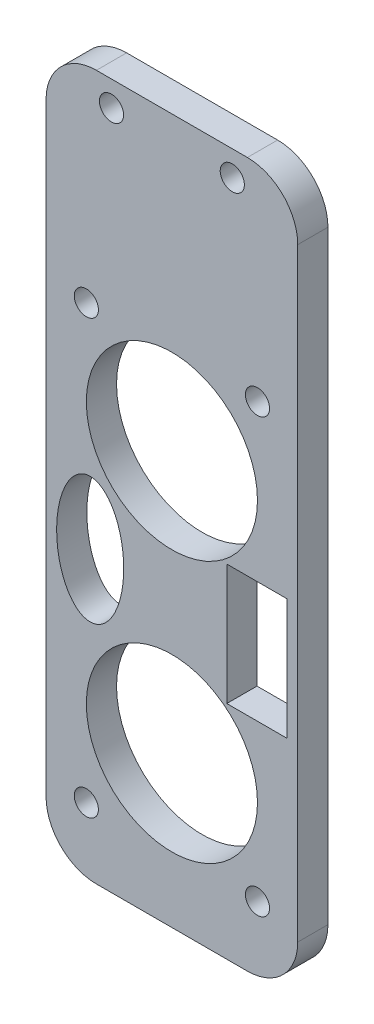
ISO-10303-21;
HEADER;
FILE_DESCRIPTION(('STEP AP214'),'2;1');
FILE_NAME('part.step','',(''),(''),'','','');
FILE_SCHEMA(('AUTOMOTIVE_DESIGN { 1 0 10303 214 1 1 1 1 }'));
ENDSEC;
DATA;
#1=APPLICATION_CONTEXT('core data for automotive mechanical design processes');
#2=APPLICATION_PROTOCOL_DEFINITION('international standard','automotive_design',2000,#1);
#3=PRODUCT_CONTEXT('',#1,'mechanical');
#4=PRODUCT('Part','Part','',(#3));
#5=PRODUCT_RELATED_PRODUCT_CATEGORY('part','',(#4));
#6=PRODUCT_DEFINITION_FORMATION('','',#4);
#7=PRODUCT_DEFINITION_CONTEXT('part definition',#1,'design');
#8=PRODUCT_DEFINITION('design','',#6,#7);
#9=PRODUCT_DEFINITION_SHAPE('','',#8);
#10=(LENGTH_UNIT() NAMED_UNIT(*) SI_UNIT(.MILLI.,.METRE.));
#11=(NAMED_UNIT(*) PLANE_ANGLE_UNIT() SI_UNIT($,.RADIAN.));
#12=(NAMED_UNIT(*) SI_UNIT($,.STERADIAN.) SOLID_ANGLE_UNIT());
#13=UNCERTAINTY_MEASURE_WITH_UNIT(LENGTH_MEASURE(1.E-05),#10,'distance_accuracy_value','');
#14=(GEOMETRIC_REPRESENTATION_CONTEXT(3) GLOBAL_UNCERTAINTY_ASSIGNED_CONTEXT((#13)) GLOBAL_UNIT_ASSIGNED_CONTEXT((#10,
#11,#12)) REPRESENTATION_CONTEXT('',''));
#15=CARTESIAN_POINT('',(0.,0.,0.));
#16=DIRECTION('',(0.,0.,1.));
#17=DIRECTION('',(1.,0.,0.));
#18=AXIS2_PLACEMENT_3D('',#15,#16,#17);
#19=CARTESIAN_POINT('',(0.,0.,3.));
#20=DIRECTION('',(0.,0.,1.));
#21=DIRECTION('',(1.,0.,0.));
#22=AXIS2_PLACEMENT_3D('',#19,#20,#21);
#23=PLANE('',#22);
#24=CARTESIAN_POINT('',(4.38203658149888,-41.5,3.));
#25=DIRECTION('',(0.,0.,-1.));
#26=DIRECTION('',(0.,-1.,0.));
#27=AXIS2_PLACEMENT_3D('',#24,#25,#26);
#28=ELLIPSE('',#27,6.26487533631212,3.33161000543766);
#29=CARTESIAN_POINT('',(4.38203658149888,-47.7648753363121,3.));
#30=VERTEX_POINT('',#29);
#31=EDGE_CURVE('E152',#30,#30,#28,.T.);
#32=ORIENTED_EDGE('',*,*,#31,.T.);
#33=EDGE_LOOP('',(#32));
#34=FACE_BOUND('',#33,.T.);
#35=DIRECTION('',(0.,-1.,0.));
#36=VECTOR('',#35,1.);
#37=CARTESIAN_POINT('',(17.9537879869003,-36.,3.));
#38=LINE('',#37,#36);
#39=CARTESIAN_POINT('',(17.9537879869003,-36.,3.));
#40=VERTEX_POINT('',#39);
#41=CARTESIAN_POINT('',(17.9537879869003,-48.,3.));
#42=VERTEX_POINT('',#41);
#43=EDGE_CURVE('E48',#40,#42,#38,.T.);
#44=ORIENTED_EDGE('',*,*,#43,.F.);
#45=DIRECTION('',(-1.,0.,0.));
#46=VECTOR('',#45,1.);
#47=CARTESIAN_POINT('',(17.9537879869003,-36.,3.));
#48=LINE('',#47,#46);
#49=CARTESIAN_POINT('',(23.9537879869003,-36.,3.));
#50=VERTEX_POINT('',#49);
#51=EDGE_CURVE('E139',#50,#40,#48,.T.);
#52=ORIENTED_EDGE('',*,*,#51,.F.);
#53=DIRECTION('',(0.,1.,0.));
#54=VECTOR('',#53,1.);
#55=CARTESIAN_POINT('',(23.9537879869003,-36.,3.));
#56=LINE('',#55,#54);
#57=CARTESIAN_POINT('',(23.9537879869003,-48.,3.));
#58=VERTEX_POINT('',#57);
#59=EDGE_CURVE('E142',#58,#50,#56,.T.);
#60=ORIENTED_EDGE('',*,*,#59,.F.);
#61=DIRECTION('',(1.,0.,0.));
#62=VECTOR('',#61,1.);
#63=CARTESIAN_POINT('',(17.9537879869003,-48.,3.));
#64=LINE('',#63,#62);
#65=EDGE_CURVE('E151',#42,#58,#64,.T.);
#66=ORIENTED_EDGE('',*,*,#65,.F.);
#67=EDGE_LOOP('',(#44,#52,#60,#66));
#68=FACE_BOUND('',#67,.T.);
#69=CARTESIAN_POINT('',(6.5,-2.5,3.));
#70=DIRECTION('',(0.,0.,1.));
#71=DIRECTION('',(1.,0.,0.));
#72=AXIS2_PLACEMENT_3D('',#69,#70,#71);
#73=CIRCLE('',#72,1.2);
#74=CARTESIAN_POINT('',(7.7,-2.5,3.));
#75=VERTEX_POINT('',#74);
#76=EDGE_CURVE('E158',#75,#75,#73,.T.);
#77=ORIENTED_EDGE('',*,*,#76,.F.);
#78=EDGE_LOOP('',(#77));
#79=FACE_BOUND('',#78,.T.);
#80=CARTESIAN_POINT('',(18.5,-2.5,3.));
#81=DIRECTION('',(0.,0.,1.));
#82=DIRECTION('',(1.,0.,0.));
#83=AXIS2_PLACEMENT_3D('',#80,#81,#82);
#84=CIRCLE('',#83,1.2);
#85=CARTESIAN_POINT('',(19.7,-2.5,3.));
#86=VERTEX_POINT('',#85);
#87=EDGE_CURVE('E165',#86,#86,#84,.T.);
#88=ORIENTED_EDGE('',*,*,#87,.F.);
#89=EDGE_LOOP('',(#88));
#90=FACE_BOUND('',#89,.T.);
#91=CARTESIAN_POINT('',(3.99999999999985,-20.5000000000001,3.));
#92=DIRECTION('',(0.,0.,1.));
#93=DIRECTION('',(1.,0.,0.));
#94=AXIS2_PLACEMENT_3D('',#91,#92,#93);
#95=CIRCLE('',#94,1.2);
#96=CARTESIAN_POINT('',(5.19999999999985,-20.5000000000001,3.));
#97=VERTEX_POINT('',#96);
#98=EDGE_CURVE('E180',#97,#97,#95,.T.);
#99=ORIENTED_EDGE('',*,*,#98,.F.);
#100=EDGE_LOOP('',(#99));
#101=FACE_BOUND('',#100,.T.);
#102=CARTESIAN_POINT('',(21.,-63.4999999999999,3.));
#103=DIRECTION('',(0.,0.,1.));
#104=DIRECTION('',(1.,0.,0.));
#105=AXIS2_PLACEMENT_3D('',#102,#103,#104);
#106=CIRCLE('',#105,1.2);
#107=CARTESIAN_POINT('',(22.2,-63.4999999999999,3.));
#108=VERTEX_POINT('',#107);
#109=EDGE_CURVE('E192',#108,#108,#106,.T.);
#110=ORIENTED_EDGE('',*,*,#109,.F.);
#111=EDGE_LOOP('',(#110));
#112=FACE_BOUND('',#111,.T.);
#113=CARTESIAN_POINT('',(12.5,-29.,3.));
#114=DIRECTION('',(0.,0.,1.));
#115=DIRECTION('',(1.,0.,0.));
#116=AXIS2_PLACEMENT_3D('',#113,#114,#115);
#117=CIRCLE('',#116,8.50000000000017);
#118=CARTESIAN_POINT('',(21.0000000000002,-29.,3.));
#119=VERTEX_POINT('',#118);
#120=EDGE_CURVE('E204',#119,#119,#117,.T.);
#121=ORIENTED_EDGE('',*,*,#120,.F.);
#122=EDGE_LOOP('',(#121));
#123=FACE_BOUND('',#122,.T.);
#124=DIRECTION('',(1.,0.,0.));
#125=VECTOR('',#124,1.);
#126=CARTESIAN_POINT('',(0.,-70.,3.));
#127=LINE('',#126,#125);
#128=CARTESIAN_POINT('',(5.00000000000001,-70.,3.));
#129=VERTEX_POINT('',#128);
#130=CARTESIAN_POINT('',(20.,-70.,3.));
#131=VERTEX_POINT('',#130);
#132=EDGE_CURVE('E213',#129,#131,#127,.T.);
#133=ORIENTED_EDGE('',*,*,#132,.T.);
#134=CARTESIAN_POINT('',(20.,-65.,3.));
#135=DIRECTION('',(0.,0.,1.));
#136=DIRECTION('',(1.,0.,0.));
#137=AXIS2_PLACEMENT_3D('',#134,#135,#136);
#138=CIRCLE('',#137,5.);
#139=CARTESIAN_POINT('',(25.,-65.,3.));
#140=VERTEX_POINT('',#139);
#141=EDGE_CURVE('E257',#131,#140,#138,.T.);
#142=ORIENTED_EDGE('',*,*,#141,.T.);
#143=DIRECTION('',(0.,1.,0.));
#144=VECTOR('',#143,1.);
#145=CARTESIAN_POINT('',(25.,0.,3.));
#146=LINE('',#145,#144);
#147=CARTESIAN_POINT('',(25.,-5.,3.));
#148=VERTEX_POINT('',#147);
#149=EDGE_CURVE('E217',#140,#148,#146,.T.);
#150=ORIENTED_EDGE('',*,*,#149,.T.);
#151=CARTESIAN_POINT('',(20.,-5.,3.));
#152=DIRECTION('',(0.,0.,1.));
#153=DIRECTION('',(1.,0.,0.));
#154=AXIS2_PLACEMENT_3D('',#151,#152,#153);
#155=CIRCLE('',#154,5.);
#156=CARTESIAN_POINT('',(20.,0.,3.));
#157=VERTEX_POINT('',#156);
#158=EDGE_CURVE('E251',#148,#157,#155,.T.);
#159=ORIENTED_EDGE('',*,*,#158,.T.);
#160=DIRECTION('',(-1.,0.,0.));
#161=VECTOR('',#160,1.);
#162=CARTESIAN_POINT('',(0.,0.,3.));
#163=LINE('',#162,#161);
#164=CARTESIAN_POINT('',(5.,0.,3.));
#165=VERTEX_POINT('',#164);
#166=EDGE_CURVE('E220',#157,#165,#163,.T.);
#167=ORIENTED_EDGE('',*,*,#166,.T.);
#168=CARTESIAN_POINT('',(5.,-5.,3.));
#169=DIRECTION('',(0.,0.,1.));
#170=DIRECTION('',(1.,0.,0.));
#171=AXIS2_PLACEMENT_3D('',#168,#169,#170);
#172=CIRCLE('',#171,5.);
#173=CARTESIAN_POINT('',(0.,-5.,3.));
#174=VERTEX_POINT('',#173);
#175=EDGE_CURVE('E253',#165,#174,#172,.T.);
#176=ORIENTED_EDGE('',*,*,#175,.T.);
#177=DIRECTION('',(0.,-1.,0.));
#178=VECTOR('',#177,1.);
#179=CARTESIAN_POINT('',(0.,0.,3.));
#180=LINE('',#179,#178);
#181=CARTESIAN_POINT('',(0.,-65.,3.));
#182=VERTEX_POINT('',#181);
#183=EDGE_CURVE('E210',#174,#182,#180,.T.);
#184=ORIENTED_EDGE('',*,*,#183,.T.);
#185=CARTESIAN_POINT('',(5.00000000000001,-65.,3.));
#186=DIRECTION('',(0.,0.,1.));
#187=DIRECTION('',(1.,0.,0.));
#188=AXIS2_PLACEMENT_3D('',#185,#186,#187);
#189=CIRCLE('',#188,5.);
#190=EDGE_CURVE('E255',#182,#129,#189,.T.);
#191=ORIENTED_EDGE('',*,*,#190,.T.);
#192=EDGE_LOOP('',(#133,#142,#150,#159,#167,#176,#184,#191));
#193=FACE_BOUND('',#192,.T.);
#194=CARTESIAN_POINT('',(12.5,-55.,3.));
#195=DIRECTION('',(0.,0.,1.));
#196=DIRECTION('',(1.,0.,0.));
#197=AXIS2_PLACEMENT_3D('',#194,#195,#196);
#198=CIRCLE('',#197,8.50000000000017);
#199=CARTESIAN_POINT('',(21.0000000000002,-55.,3.));
#200=VERTEX_POINT('',#199);
#201=EDGE_CURVE('E198',#200,#200,#198,.T.);
#202=ORIENTED_EDGE('',*,*,#201,.F.);
#203=EDGE_LOOP('',(#202));
#204=FACE_BOUND('',#203,.T.);
#205=CARTESIAN_POINT('',(4.,-63.5000000000001,3.));
#206=DIRECTION('',(0.,0.,1.));
#207=DIRECTION('',(1.,0.,0.));
#208=AXIS2_PLACEMENT_3D('',#205,#206,#207);
#209=CIRCLE('',#208,1.2);
#210=CARTESIAN_POINT('',(5.2,-63.5000000000001,3.));
#211=VERTEX_POINT('',#210);
#212=EDGE_CURVE('E186',#211,#211,#209,.T.);
#213=ORIENTED_EDGE('',*,*,#212,.F.);
#214=EDGE_LOOP('',(#213));
#215=FACE_BOUND('',#214,.T.);
#216=CARTESIAN_POINT('',(20.9999999999999,-20.5,3.));
#217=DIRECTION('',(0.,0.,1.));
#218=DIRECTION('',(1.,0.,0.));
#219=AXIS2_PLACEMENT_3D('',#216,#217,#218);
#220=CIRCLE('',#219,1.2);
#221=CARTESIAN_POINT('',(22.1999999999999,-20.5,3.));
#222=VERTEX_POINT('',#221);
#223=EDGE_CURVE('E174',#222,#222,#220,.T.);
#224=ORIENTED_EDGE('',*,*,#223,.F.);
#225=EDGE_LOOP('',(#224));
#226=FACE_BOUND('',#225,.T.);
#227=ADVANCED_FACE('F33',(#34,#68,#79,#90,#101,#112,#123,#193,#204,#215,#226),#23,.T.);
#228=CARTESIAN_POINT('',(0.,0.,0.));
#229=DIRECTION('',(0.,0.,1.));
#230=DIRECTION('',(1.,0.,0.));
#231=AXIS2_PLACEMENT_3D('',#228,#229,#230);
#232=PLANE('',#231);
#233=CARTESIAN_POINT('',(4.38203658149888,-41.5,0.));
#234=DIRECTION('',(0.,0.,-1.));
#235=DIRECTION('',(0.,-1.,0.));
#236=AXIS2_PLACEMENT_3D('',#233,#234,#235);
#237=ELLIPSE('',#236,6.26487533631212,3.33161000543766);
#238=CARTESIAN_POINT('',(4.38203658149888,-47.7648753363121,0.));
#239=VERTEX_POINT('',#238);
#240=EDGE_CURVE('E145',#239,#239,#237,.T.);
#241=ORIENTED_EDGE('',*,*,#240,.F.);
#242=EDGE_LOOP('',(#241));
#243=FACE_BOUND('',#242,.T.);
#244=DIRECTION('',(-1.,0.,0.));
#245=VECTOR('',#244,1.);
#246=CARTESIAN_POINT('',(17.9537879869003,-36.,0.));
#247=LINE('',#246,#245);
#248=CARTESIAN_POINT('',(23.9537879869003,-36.,0.));
#249=VERTEX_POINT('',#248);
#250=CARTESIAN_POINT('',(17.9537879869003,-36.,0.));
#251=VERTEX_POINT('',#250);
#252=EDGE_CURVE('E129',#249,#251,#247,.T.);
#253=ORIENTED_EDGE('',*,*,#252,.T.);
#254=DIRECTION('',(0.,-1.,0.));
#255=VECTOR('',#254,1.);
#256=CARTESIAN_POINT('',(17.9537879869003,-36.,0.));
#257=LINE('',#256,#255);
#258=CARTESIAN_POINT('',(17.9537879869003,-48.,0.));
#259=VERTEX_POINT('',#258);
#260=EDGE_CURVE('E123',#251,#259,#257,.T.);
#261=ORIENTED_EDGE('',*,*,#260,.T.);
#262=DIRECTION('',(1.,0.,0.));
#263=VECTOR('',#262,1.);
#264=CARTESIAN_POINT('',(17.9537879869003,-48.,0.));
#265=LINE('',#264,#263);
#266=CARTESIAN_POINT('',(23.9537879869003,-48.,0.));
#267=VERTEX_POINT('',#266);
#268=EDGE_CURVE('E132',#259,#267,#265,.T.);
#269=ORIENTED_EDGE('',*,*,#268,.T.);
#270=DIRECTION('',(0.,1.,0.));
#271=VECTOR('',#270,1.);
#272=CARTESIAN_POINT('',(23.9537879869003,-36.,0.));
#273=LINE('',#272,#271);
#274=EDGE_CURVE('E56',#267,#249,#273,.T.);
#275=ORIENTED_EDGE('',*,*,#274,.T.);
#276=EDGE_LOOP('',(#253,#261,#269,#275));
#277=FACE_BOUND('',#276,.T.);
#278=CARTESIAN_POINT('',(6.5,-2.5,0.));
#279=DIRECTION('',(0.,0.,1.));
#280=DIRECTION('',(1.,0.,0.));
#281=AXIS2_PLACEMENT_3D('',#278,#279,#280);
#282=CIRCLE('',#281,1.2);
#283=CARTESIAN_POINT('',(7.7,-2.5,0.));
#284=VERTEX_POINT('',#283);
#285=EDGE_CURVE('E162',#284,#284,#282,.F.);
#286=ORIENTED_EDGE('',*,*,#285,.F.);
#287=EDGE_LOOP('',(#286));
#288=FACE_BOUND('',#287,.T.);
#289=CARTESIAN_POINT('',(18.5,-2.5,0.));
#290=DIRECTION('',(0.,0.,1.));
#291=DIRECTION('',(1.,0.,0.));
#292=AXIS2_PLACEMENT_3D('',#289,#290,#291);
#293=CIRCLE('',#292,1.2);
#294=CARTESIAN_POINT('',(19.7,-2.5,0.));
#295=VERTEX_POINT('',#294);
#296=EDGE_CURVE('E168',#295,#295,#293,.F.);
#297=ORIENTED_EDGE('',*,*,#296,.F.);
#298=EDGE_LOOP('',(#297));
#299=FACE_BOUND('',#298,.T.);
#300=DIRECTION('',(0.,1.,0.));
#301=VECTOR('',#300,1.);
#302=CARTESIAN_POINT('',(25.,0.,0.));
#303=LINE('',#302,#301);
#304=CARTESIAN_POINT('',(25.,-65.,0.));
#305=VERTEX_POINT('',#304);
#306=CARTESIAN_POINT('',(25.,-5.,0.));
#307=VERTEX_POINT('',#306);
#308=EDGE_CURVE('E229',#305,#307,#303,.T.);
#309=ORIENTED_EDGE('',*,*,#308,.F.);
#310=CARTESIAN_POINT('',(20.,-65.,0.));
#311=DIRECTION('',(0.,0.,1.));
#312=DIRECTION('',(1.,0.,0.));
#313=AXIS2_PLACEMENT_3D('',#310,#311,#312);
#314=CIRCLE('',#313,5.);
#315=CARTESIAN_POINT('',(20.,-70.,0.));
#316=VERTEX_POINT('',#315);
#317=EDGE_CURVE('E244',#305,#316,#314,.F.);
#318=ORIENTED_EDGE('',*,*,#317,.T.);
#319=DIRECTION('',(1.,0.,0.));
#320=VECTOR('',#319,1.);
#321=CARTESIAN_POINT('',(0.,-70.,0.));
#322=LINE('',#321,#320);
#323=CARTESIAN_POINT('',(5.00000000000001,-70.,0.));
#324=VERTEX_POINT('',#323);
#325=EDGE_CURVE('E226',#324,#316,#322,.T.);
#326=ORIENTED_EDGE('',*,*,#325,.F.);
#327=CARTESIAN_POINT('',(5.00000000000001,-65.,0.));
#328=DIRECTION('',(0.,0.,1.));
#329=DIRECTION('',(1.,0.,0.));
#330=AXIS2_PLACEMENT_3D('',#327,#328,#329);
#331=CIRCLE('',#330,5.);
#332=CARTESIAN_POINT('',(0.,-65.,0.));
#333=VERTEX_POINT('',#332);
#334=EDGE_CURVE('E242',#324,#333,#331,.F.);
#335=ORIENTED_EDGE('',*,*,#334,.T.);
#336=DIRECTION('',(0.,-1.,0.));
#337=VECTOR('',#336,1.);
#338=CARTESIAN_POINT('',(0.,0.,0.));
#339=LINE('',#338,#337);
#340=CARTESIAN_POINT('',(0.,-5.,0.));
#341=VERTEX_POINT('',#340);
#342=EDGE_CURVE('E207',#341,#333,#339,.T.);
#343=ORIENTED_EDGE('',*,*,#342,.F.);
#344=CARTESIAN_POINT('',(5.,-5.,0.));
#345=DIRECTION('',(0.,0.,1.));
#346=DIRECTION('',(1.,0.,0.));
#347=AXIS2_PLACEMENT_3D('',#344,#345,#346);
#348=CIRCLE('',#347,5.);
#349=CARTESIAN_POINT('',(5.,0.,0.));
#350=VERTEX_POINT('',#349);
#351=EDGE_CURVE('E240',#341,#350,#348,.F.);
#352=ORIENTED_EDGE('',*,*,#351,.T.);
#353=DIRECTION('',(-1.,0.,0.));
#354=VECTOR('',#353,1.);
#355=CARTESIAN_POINT('',(0.,0.,0.));
#356=LINE('',#355,#354);
#357=CARTESIAN_POINT('',(20.,0.,0.));
#358=VERTEX_POINT('',#357);
#359=EDGE_CURVE('E214',#358,#350,#356,.T.);
#360=ORIENTED_EDGE('',*,*,#359,.F.);
#361=CARTESIAN_POINT('',(20.,-5.,0.));
#362=DIRECTION('',(0.,0.,1.));
#363=DIRECTION('',(1.,0.,0.));
#364=AXIS2_PLACEMENT_3D('',#361,#362,#363);
#365=CIRCLE('',#364,5.);
#366=EDGE_CURVE('E238',#358,#307,#365,.F.);
#367=ORIENTED_EDGE('',*,*,#366,.T.);
#368=EDGE_LOOP('',(#309,#318,#326,#335,#343,#352,#360,#367));
#369=FACE_BOUND('',#368,.T.);
#370=CARTESIAN_POINT('',(12.5,-29.,0.));
#371=DIRECTION('',(0.,0.,1.));
#372=DIRECTION('',(1.,0.,0.));
#373=AXIS2_PLACEMENT_3D('',#370,#371,#372);
#374=CIRCLE('',#373,8.50000000000017);
#375=CARTESIAN_POINT('',(21.0000000000002,-29.,0.));
#376=VERTEX_POINT('',#375);
#377=EDGE_CURVE('E201',#376,#376,#374,.T.);
#378=ORIENTED_EDGE('',*,*,#377,.T.);
#379=EDGE_LOOP('',(#378));
#380=FACE_BOUND('',#379,.T.);
#381=CARTESIAN_POINT('',(12.5,-55.,0.));
#382=DIRECTION('',(0.,0.,1.));
#383=DIRECTION('',(1.,0.,0.));
#384=AXIS2_PLACEMENT_3D('',#381,#382,#383);
#385=CIRCLE('',#384,8.50000000000017);
#386=CARTESIAN_POINT('',(21.0000000000002,-55.,0.));
#387=VERTEX_POINT('',#386);
#388=EDGE_CURVE('E195',#387,#387,#385,.T.);
#389=ORIENTED_EDGE('',*,*,#388,.T.);
#390=EDGE_LOOP('',(#389));
#391=FACE_BOUND('',#390,.T.);
#392=CARTESIAN_POINT('',(21.,-63.4999999999999,0.));
#393=DIRECTION('',(0.,0.,1.));
#394=DIRECTION('',(1.,0.,0.));
#395=AXIS2_PLACEMENT_3D('',#392,#393,#394);
#396=CIRCLE('',#395,1.2);
#397=CARTESIAN_POINT('',(22.2,-63.4999999999999,0.));
#398=VERTEX_POINT('',#397);
#399=EDGE_CURVE('E189',#398,#398,#396,.T.);
#400=ORIENTED_EDGE('',*,*,#399,.T.);
#401=EDGE_LOOP('',(#400));
#402=FACE_BOUND('',#401,.T.);
#403=CARTESIAN_POINT('',(4.,-63.5000000000001,0.));
#404=DIRECTION('',(0.,0.,1.));
#405=DIRECTION('',(1.,0.,0.));
#406=AXIS2_PLACEMENT_3D('',#403,#404,#405);
#407=CIRCLE('',#406,1.2);
#408=CARTESIAN_POINT('',(5.2,-63.5000000000001,0.));
#409=VERTEX_POINT('',#408);
#410=EDGE_CURVE('E183',#409,#409,#407,.T.);
#411=ORIENTED_EDGE('',*,*,#410,.T.);
#412=EDGE_LOOP('',(#411));
#413=FACE_BOUND('',#412,.T.);
#414=CARTESIAN_POINT('',(3.99999999999985,-20.5000000000001,0.));
#415=DIRECTION('',(0.,0.,1.));
#416=DIRECTION('',(1.,0.,0.));
#417=AXIS2_PLACEMENT_3D('',#414,#415,#416);
#418=CIRCLE('',#417,1.2);
#419=CARTESIAN_POINT('',(5.19999999999985,-20.5000000000001,0.));
#420=VERTEX_POINT('',#419);
#421=EDGE_CURVE('E177',#420,#420,#418,.T.);
#422=ORIENTED_EDGE('',*,*,#421,.T.);
#423=EDGE_LOOP('',(#422));
#424=FACE_BOUND('',#423,.T.);
#425=CARTESIAN_POINT('',(20.9999999999999,-20.5,0.));
#426=DIRECTION('',(0.,0.,1.));
#427=DIRECTION('',(1.,0.,0.));
#428=AXIS2_PLACEMENT_3D('',#425,#426,#427);
#429=CIRCLE('',#428,1.2);
#430=CARTESIAN_POINT('',(22.1999999999999,-20.5,0.));
#431=VERTEX_POINT('',#430);
#432=EDGE_CURVE('E171',#431,#431,#429,.T.);
#433=ORIENTED_EDGE('',*,*,#432,.T.);
#434=EDGE_LOOP('',(#433));
#435=FACE_BOUND('',#434,.T.);
#436=ADVANCED_FACE('F136',(#243,#277,#288,#299,#369,#380,#391,#402,#413,#424,#435),#232,.F.);
#437=CARTESIAN_POINT('',(0.,0.,3.));
#438=DIRECTION('',(1.,0.,0.));
#439=DIRECTION('',(0.,1.,0.));
#440=AXIS2_PLACEMENT_3D('',#437,#438,#439);
#441=PLANE('',#440);
#442=ORIENTED_EDGE('',*,*,#342,.T.);
#443=DIRECTION('',(0.,0.,-1.));
#444=VECTOR('',#443,1.);
#445=CARTESIAN_POINT('',(0.,-65.,3.));
#446=LINE('',#445,#444);
#447=EDGE_CURVE('E262',#333,#182,#446,.F.);
#448=ORIENTED_EDGE('',*,*,#447,.T.);
#449=ORIENTED_EDGE('',*,*,#183,.F.);
#450=DIRECTION('',(0.,0.,-1.));
#451=VECTOR('',#450,1.);
#452=CARTESIAN_POINT('',(0.,-5.,3.));
#453=LINE('',#452,#451);
#454=EDGE_CURVE('E259',#174,#341,#453,.T.);
#455=ORIENTED_EDGE('',*,*,#454,.T.);
#456=EDGE_LOOP('',(#442,#448,#449,#455));
#457=FACE_BOUND('',#456,.T.);
#458=ADVANCED_FACE('F282',(#457),#441,.F.);
#459=CARTESIAN_POINT('',(0.,-70.,3.));
#460=DIRECTION('',(0.,1.,0.));
#461=DIRECTION('',(0.,0.,1.));
#462=AXIS2_PLACEMENT_3D('',#459,#460,#461);
#463=PLANE('',#462);
#464=ORIENTED_EDGE('',*,*,#325,.T.);
#465=DIRECTION('',(0.,0.,-1.));
#466=VECTOR('',#465,1.);
#467=CARTESIAN_POINT('',(20.,-70.,3.));
#468=LINE('',#467,#466);
#469=EDGE_CURVE('E249',#316,#131,#468,.F.);
#470=ORIENTED_EDGE('',*,*,#469,.T.);
#471=ORIENTED_EDGE('',*,*,#132,.F.);
#472=DIRECTION('',(0.,0.,-1.));
#473=VECTOR('',#472,1.);
#474=CARTESIAN_POINT('',(5.00000000000001,-70.,3.));
#475=LINE('',#474,#473);
#476=EDGE_CURVE('E246',#129,#324,#475,.T.);
#477=ORIENTED_EDGE('',*,*,#476,.T.);
#478=EDGE_LOOP('',(#464,#470,#471,#477));
#479=FACE_BOUND('',#478,.T.);
#480=ADVANCED_FACE('F293',(#479),#463,.F.);
#481=CARTESIAN_POINT('',(25.,0.,3.));
#482=DIRECTION('',(-1.,0.,0.));
#483=DIRECTION('',(0.,-1.,0.));
#484=AXIS2_PLACEMENT_3D('',#481,#482,#483);
#485=PLANE('',#484);
#486=ORIENTED_EDGE('',*,*,#149,.F.);
#487=DIRECTION('',(0.,0.,-1.));
#488=VECTOR('',#487,1.);
#489=CARTESIAN_POINT('',(25.,-65.,3.));
#490=LINE('',#489,#488);
#491=EDGE_CURVE('E235',#140,#305,#490,.T.);
#492=ORIENTED_EDGE('',*,*,#491,.T.);
#493=ORIENTED_EDGE('',*,*,#308,.T.);
#494=DIRECTION('',(0.,0.,-1.));
#495=VECTOR('',#494,1.);
#496=CARTESIAN_POINT('',(25.,-5.,3.));
#497=LINE('',#496,#495);
#498=EDGE_CURVE('E223',#307,#148,#497,.F.);
#499=ORIENTED_EDGE('',*,*,#498,.T.);
#500=EDGE_LOOP('',(#486,#492,#493,#499));
#501=FACE_BOUND('',#500,.T.);
#502=ADVANCED_FACE('F301',(#501),#485,.F.);
#503=CARTESIAN_POINT('',(0.,0.,3.));
#504=DIRECTION('',(0.,-1.,0.));
#505=DIRECTION('',(0.,0.,-1.));
#506=AXIS2_PLACEMENT_3D('',#503,#504,#505);
#507=PLANE('',#506);
#508=ORIENTED_EDGE('',*,*,#359,.T.);
#509=DIRECTION('',(0.,0.,-1.));
#510=VECTOR('',#509,1.);
#511=CARTESIAN_POINT('',(5.,0.,3.));
#512=LINE('',#511,#510);
#513=EDGE_CURVE('E11',#350,#165,#512,.F.);
#514=ORIENTED_EDGE('',*,*,#513,.T.);
#515=ORIENTED_EDGE('',*,*,#166,.F.);
#516=DIRECTION('',(0.,0.,-1.));
#517=VECTOR('',#516,1.);
#518=CARTESIAN_POINT('',(20.,0.,3.));
#519=LINE('',#518,#517);
#520=EDGE_CURVE('E41',#157,#358,#519,.T.);
#521=ORIENTED_EDGE('',*,*,#520,.T.);
#522=EDGE_LOOP('',(#508,#514,#515,#521));
#523=FACE_BOUND('',#522,.T.);
#524=ADVANCED_FACE('F268',(#523),#507,.F.);
#525=CARTESIAN_POINT('',(12.5,-29.,3.));
#526=DIRECTION('',(0.,0.,-1.));
#527=DIRECTION('',(-1.,0.,0.));
#528=AXIS2_PLACEMENT_3D('',#525,#526,#527);
#529=CYLINDRICAL_SURFACE('',#528,8.50000000000017);
#530=ORIENTED_EDGE('',*,*,#120,.T.);
#531=EDGE_LOOP('',(#530));
#532=FACE_BOUND('',#531,.T.);
#533=ORIENTED_EDGE('',*,*,#377,.F.);
#534=EDGE_LOOP('',(#533));
#535=FACE_BOUND('',#534,.T.);
#536=ADVANCED_FACE('F323',(#532,#535),#529,.F.);
#537=CARTESIAN_POINT('',(12.5,-55.,3.));
#538=DIRECTION('',(0.,0.,-1.));
#539=DIRECTION('',(-1.,0.,0.));
#540=AXIS2_PLACEMENT_3D('',#537,#538,#539);
#541=CYLINDRICAL_SURFACE('',#540,8.50000000000017);
#542=ORIENTED_EDGE('',*,*,#201,.T.);
#543=EDGE_LOOP('',(#542));
#544=FACE_BOUND('',#543,.T.);
#545=ORIENTED_EDGE('',*,*,#388,.F.);
#546=EDGE_LOOP('',(#545));
#547=FACE_BOUND('',#546,.T.);
#548=ADVANCED_FACE('F444',(#544,#547),#541,.F.);
#549=CARTESIAN_POINT('',(21.,-63.4999999999999,3.));
#550=DIRECTION('',(0.,0.,-1.));
#551=DIRECTION('',(-1.,0.,0.));
#552=AXIS2_PLACEMENT_3D('',#549,#550,#551);
#553=CYLINDRICAL_SURFACE('',#552,1.2);
#554=ORIENTED_EDGE('',*,*,#109,.T.);
#555=EDGE_LOOP('',(#554));
#556=FACE_BOUND('',#555,.T.);
#557=ORIENTED_EDGE('',*,*,#399,.F.);
#558=EDGE_LOOP('',(#557));
#559=FACE_BOUND('',#558,.T.);
#560=ADVANCED_FACE('F441',(#556,#559),#553,.F.);
#561=CARTESIAN_POINT('',(4.,-63.5000000000001,3.));
#562=DIRECTION('',(0.,0.,-1.));
#563=DIRECTION('',(-1.,0.,0.));
#564=AXIS2_PLACEMENT_3D('',#561,#562,#563);
#565=CYLINDRICAL_SURFACE('',#564,1.2);
#566=ORIENTED_EDGE('',*,*,#212,.T.);
#567=EDGE_LOOP('',(#566));
#568=FACE_BOUND('',#567,.T.);
#569=ORIENTED_EDGE('',*,*,#410,.F.);
#570=EDGE_LOOP('',(#569));
#571=FACE_BOUND('',#570,.T.);
#572=ADVANCED_FACE('F437',(#568,#571),#565,.F.);
#573=CARTESIAN_POINT('',(3.99999999999985,-20.5000000000001,3.));
#574=DIRECTION('',(0.,0.,-1.));
#575=DIRECTION('',(-1.,0.,0.));
#576=AXIS2_PLACEMENT_3D('',#573,#574,#575);
#577=CYLINDRICAL_SURFACE('',#576,1.2);
#578=ORIENTED_EDGE('',*,*,#98,.T.);
#579=EDGE_LOOP('',(#578));
#580=FACE_BOUND('',#579,.T.);
#581=ORIENTED_EDGE('',*,*,#421,.F.);
#582=EDGE_LOOP('',(#581));
#583=FACE_BOUND('',#582,.T.);
#584=ADVANCED_FACE('F433',(#580,#583),#577,.F.);
#585=CARTESIAN_POINT('',(20.9999999999999,-20.5,3.));
#586=DIRECTION('',(0.,0.,-1.));
#587=DIRECTION('',(-1.,0.,0.));
#588=AXIS2_PLACEMENT_3D('',#585,#586,#587);
#589=CYLINDRICAL_SURFACE('',#588,1.2);
#590=ORIENTED_EDGE('',*,*,#223,.T.);
#591=EDGE_LOOP('',(#590));
#592=FACE_BOUND('',#591,.T.);
#593=ORIENTED_EDGE('',*,*,#432,.F.);
#594=EDGE_LOOP('',(#593));
#595=FACE_BOUND('',#594,.T.);
#596=ADVANCED_FACE('F336',(#592,#595),#589,.F.);
#597=CARTESIAN_POINT('',(20.,-65.,3.));
#598=DIRECTION('',(0.,0.,-1.));
#599=DIRECTION('',(-1.,0.,0.));
#600=AXIS2_PLACEMENT_3D('',#597,#598,#599);
#601=CYLINDRICAL_SURFACE('',#600,5.);
#602=ORIENTED_EDGE('',*,*,#141,.F.);
#603=ORIENTED_EDGE('',*,*,#469,.F.);
#604=ORIENTED_EDGE('',*,*,#317,.F.);
#605=ORIENTED_EDGE('',*,*,#491,.F.);
#606=EDGE_LOOP('',(#602,#603,#604,#605));
#607=FACE_BOUND('',#606,.T.);
#608=ADVANCED_FACE('F298',(#607),#601,.T.);
#609=CARTESIAN_POINT('',(5.00000000000001,-65.,3.));
#610=DIRECTION('',(0.,0.,-1.));
#611=DIRECTION('',(-1.,0.,0.));
#612=AXIS2_PLACEMENT_3D('',#609,#610,#611);
#613=CYLINDRICAL_SURFACE('',#612,5.);
#614=ORIENTED_EDGE('',*,*,#190,.F.);
#615=ORIENTED_EDGE('',*,*,#447,.F.);
#616=ORIENTED_EDGE('',*,*,#334,.F.);
#617=ORIENTED_EDGE('',*,*,#476,.F.);
#618=EDGE_LOOP('',(#614,#615,#616,#617));
#619=FACE_BOUND('',#618,.T.);
#620=ADVANCED_FACE('F290',(#619),#613,.T.);
#621=CARTESIAN_POINT('',(5.,-5.,3.));
#622=DIRECTION('',(0.,0.,-1.));
#623=DIRECTION('',(-1.,0.,0.));
#624=AXIS2_PLACEMENT_3D('',#621,#622,#623);
#625=CYLINDRICAL_SURFACE('',#624,5.);
#626=ORIENTED_EDGE('',*,*,#175,.F.);
#627=ORIENTED_EDGE('',*,*,#513,.F.);
#628=ORIENTED_EDGE('',*,*,#351,.F.);
#629=ORIENTED_EDGE('',*,*,#454,.F.);
#630=EDGE_LOOP('',(#626,#627,#628,#629));
#631=FACE_BOUND('',#630,.T.);
#632=ADVANCED_FACE('F279',(#631),#625,.T.);
#633=CARTESIAN_POINT('',(20.,-5.,3.));
#634=DIRECTION('',(0.,0.,-1.));
#635=DIRECTION('',(-1.,0.,0.));
#636=AXIS2_PLACEMENT_3D('',#633,#634,#635);
#637=CYLINDRICAL_SURFACE('',#636,5.);
#638=ORIENTED_EDGE('',*,*,#158,.F.);
#639=ORIENTED_EDGE('',*,*,#498,.F.);
#640=ORIENTED_EDGE('',*,*,#366,.F.);
#641=ORIENTED_EDGE('',*,*,#520,.F.);
#642=EDGE_LOOP('',(#638,#639,#640,#641));
#643=FACE_BOUND('',#642,.T.);
#644=ADVANCED_FACE('F35',(#643),#637,.T.);
#645=CARTESIAN_POINT('',(18.5,-2.5,3.));
#646=DIRECTION('',(0.,0.,1.));
#647=DIRECTION('',(1.,0.,0.));
#648=AXIS2_PLACEMENT_3D('',#645,#646,#647);
#649=CYLINDRICAL_SURFACE('',#648,1.2);
#650=ORIENTED_EDGE('',*,*,#296,.T.);
#651=EDGE_LOOP('',(#650));
#652=FACE_BOUND('',#651,.T.);
#653=ORIENTED_EDGE('',*,*,#87,.T.);
#654=EDGE_LOOP('',(#653));
#655=FACE_BOUND('',#654,.T.);
#656=ADVANCED_FACE('F304',(#652,#655),#649,.F.);
#657=CARTESIAN_POINT('',(6.5,-2.5,3.));
#658=DIRECTION('',(0.,0.,1.));
#659=DIRECTION('',(1.,0.,0.));
#660=AXIS2_PLACEMENT_3D('',#657,#658,#659);
#661=CYLINDRICAL_SURFACE('',#660,1.2);
#662=ORIENTED_EDGE('',*,*,#285,.T.);
#663=EDGE_LOOP('',(#662));
#664=FACE_BOUND('',#663,.T.);
#665=ORIENTED_EDGE('',*,*,#76,.T.);
#666=EDGE_LOOP('',(#665));
#667=FACE_BOUND('',#666,.T.);
#668=ADVANCED_FACE('F309',(#664,#667),#661,.F.);
#669=CARTESIAN_POINT('',(17.9537879869003,-36.,0.));
#670=DIRECTION('',(-1.,0.,0.));
#671=DIRECTION('',(0.,0.,1.));
#672=AXIS2_PLACEMENT_3D('',#669,#670,#671);
#673=PLANE('',#672);
#674=ORIENTED_EDGE('',*,*,#43,.T.);
#675=DIRECTION('',(0.,0.,1.));
#676=VECTOR('',#675,1.);
#677=CARTESIAN_POINT('',(17.9537879869003,-48.,0.));
#678=LINE('',#677,#676);
#679=EDGE_CURVE('E119',#259,#42,#678,.T.);
#680=ORIENTED_EDGE('',*,*,#679,.F.);
#681=ORIENTED_EDGE('',*,*,#260,.F.);
#682=DIRECTION('',(0.,0.,1.));
#683=VECTOR('',#682,1.);
#684=CARTESIAN_POINT('',(17.9537879869003,-36.,0.));
#685=LINE('',#684,#683);
#686=EDGE_CURVE('E156',#251,#40,#685,.T.);
#687=ORIENTED_EDGE('',*,*,#686,.T.);
#688=EDGE_LOOP('',(#674,#680,#681,#687));
#689=FACE_BOUND('',#688,.T.);
#690=ADVANCED_FACE('F121',(#689),#673,.F.);
#691=CARTESIAN_POINT('',(17.9537879869003,-36.,0.));
#692=DIRECTION('',(0.,1.,0.));
#693=DIRECTION('',(0.,0.,1.));
#694=AXIS2_PLACEMENT_3D('',#691,#692,#693);
#695=PLANE('',#694);
#696=ORIENTED_EDGE('',*,*,#51,.T.);
#697=ORIENTED_EDGE('',*,*,#686,.F.);
#698=ORIENTED_EDGE('',*,*,#252,.F.);
#699=DIRECTION('',(0.,0.,1.));
#700=VECTOR('',#699,1.);
#701=CARTESIAN_POINT('',(23.9537879869003,-36.,0.));
#702=LINE('',#701,#700);
#703=EDGE_CURVE('E159',#249,#50,#702,.T.);
#704=ORIENTED_EDGE('',*,*,#703,.T.);
#705=EDGE_LOOP('',(#696,#697,#698,#704));
#706=FACE_BOUND('',#705,.T.);
#707=ADVANCED_FACE('F375',(#706),#695,.F.);
#708=CARTESIAN_POINT('',(23.9537879869003,-36.,0.));
#709=DIRECTION('',(1.,0.,0.));
#710=DIRECTION('',(0.,0.,-1.));
#711=AXIS2_PLACEMENT_3D('',#708,#709,#710);
#712=PLANE('',#711);
#713=ORIENTED_EDGE('',*,*,#59,.T.);
#714=ORIENTED_EDGE('',*,*,#703,.F.);
#715=ORIENTED_EDGE('',*,*,#274,.F.);
#716=DIRECTION('',(0.,0.,1.));
#717=VECTOR('',#716,1.);
#718=CARTESIAN_POINT('',(23.9537879869003,-48.,0.));
#719=LINE('',#718,#717);
#720=EDGE_CURVE('E128',#267,#58,#719,.T.);
#721=ORIENTED_EDGE('',*,*,#720,.T.);
#722=EDGE_LOOP('',(#713,#714,#715,#721));
#723=FACE_BOUND('',#722,.T.);
#724=ADVANCED_FACE('F384',(#723),#712,.F.);
#725=CARTESIAN_POINT('',(17.9537879869003,-48.,0.));
#726=DIRECTION('',(0.,-1.,0.));
#727=DIRECTION('',(0.,0.,-1.));
#728=AXIS2_PLACEMENT_3D('',#725,#726,#727);
#729=PLANE('',#728);
#730=ORIENTED_EDGE('',*,*,#65,.T.);
#731=ORIENTED_EDGE('',*,*,#720,.F.);
#732=ORIENTED_EDGE('',*,*,#268,.F.);
#733=ORIENTED_EDGE('',*,*,#679,.T.);
#734=EDGE_LOOP('',(#730,#731,#732,#733));
#735=FACE_BOUND('',#734,.T.);
#736=ADVANCED_FACE('F133',(#735),#729,.F.);
#737=DIRECTION('',(0.,0.,-1.));
#738=VECTOR('',#737,1.);
#739=SURFACE_OF_LINEAR_EXTRUSION('',#28,#738);
#740=ORIENTED_EDGE('',*,*,#31,.F.);
#741=EDGE_LOOP('',(#740));
#742=FACE_BOUND('',#741,.T.);
#743=ORIENTED_EDGE('',*,*,#240,.T.);
#744=EDGE_LOOP('',(#743));
#745=FACE_BOUND('',#744,.T.);
#746=ADVANCED_FACE('F401',(#742,#745),#739,.F.);
#747=CLOSED_SHELL('',(#227,#436,#458,#480,#502,#524,#536,#548,#560,#572,#584,#596,#608,#620,
#632,#644,#656,#668,#690,#707,#724,#736,#746));
#748=MANIFOLD_SOLID_BREP('B2',#747);
#749=ADVANCED_BREP_SHAPE_REPRESENTATION('',(#18,#748),#14);
#750=SHAPE_DEFINITION_REPRESENTATION(#9,#749);
ENDSEC;
END-ISO-10303-21;
